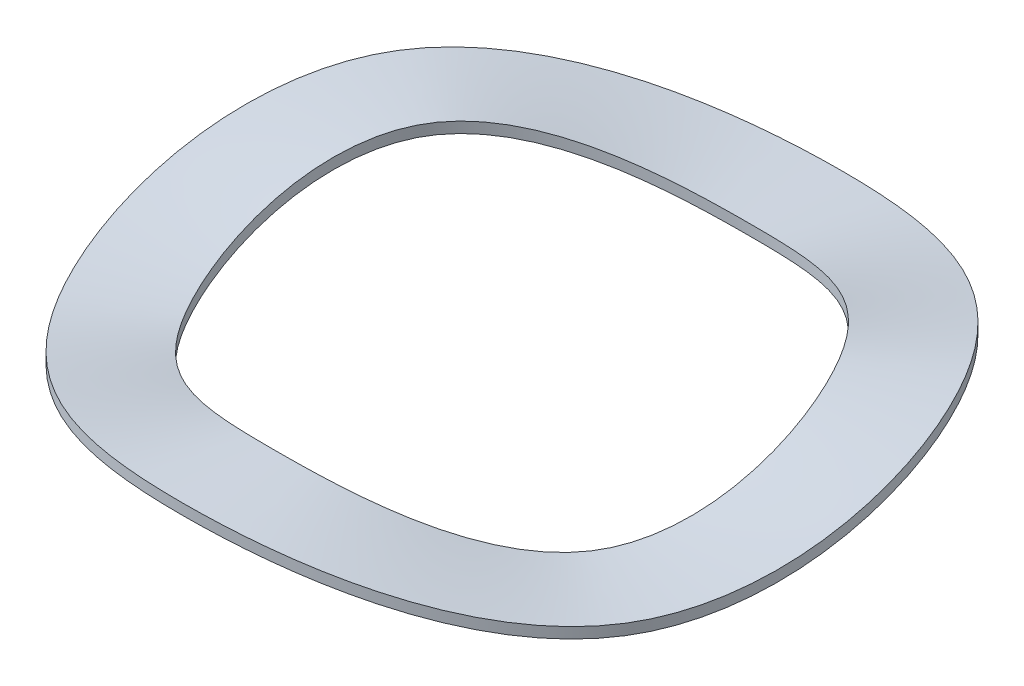
ISO-10303-21;
HEADER;
FILE_DESCRIPTION(('STEP AP214'),'2;1');
FILE_NAME('part.step','',(''),(''),'','','');
FILE_SCHEMA(('AUTOMOTIVE_DESIGN { 1 0 10303 214 1 1 1 1 }'));
ENDSEC;
DATA;
#1=APPLICATION_CONTEXT('core data for automotive mechanical design processes');
#2=APPLICATION_PROTOCOL_DEFINITION('international standard','automotive_design',2000,#1);
#3=PRODUCT_CONTEXT('',#1,'mechanical');
#4=PRODUCT('Part','Part','',(#3));
#5=PRODUCT_RELATED_PRODUCT_CATEGORY('part','',(#4));
#6=PRODUCT_DEFINITION_FORMATION('','',#4);
#7=PRODUCT_DEFINITION_CONTEXT('part definition',#1,'design');
#8=PRODUCT_DEFINITION('design','',#6,#7);
#9=PRODUCT_DEFINITION_SHAPE('','',#8);
#10=(LENGTH_UNIT() NAMED_UNIT(*) SI_UNIT(.MILLI.,.METRE.));
#11=(NAMED_UNIT(*) PLANE_ANGLE_UNIT() SI_UNIT($,.RADIAN.));
#12=(NAMED_UNIT(*) SI_UNIT($,.STERADIAN.) SOLID_ANGLE_UNIT());
#13=UNCERTAINTY_MEASURE_WITH_UNIT(LENGTH_MEASURE(1.E-05),#10,'distance_accuracy_value','');
#14=(GEOMETRIC_REPRESENTATION_CONTEXT(3) GLOBAL_UNCERTAINTY_ASSIGNED_CONTEXT((#13)) GLOBAL_UNIT_ASSIGNED_CONTEXT((#10,
#11,#12)) REPRESENTATION_CONTEXT('',''));
#15=CARTESIAN_POINT('',(0.,0.,0.));
#16=DIRECTION('',(0.,0.,1.));
#17=DIRECTION('',(1.,0.,0.));
#18=AXIS2_PLACEMENT_3D('',#15,#16,#17);
#19=CARTESIAN_POINT('',(0.,0.,-4.6609));
#20=CARTESIAN_POINT('',(1.61458312179956,0.,-4.66090000000001));
#21=CARTESIAN_POINT('',(4.84374936539867,1.2192,-2.79654000000002));
#22=CARTESIAN_POINT('',(4.84374936539864,-0.609599999999999,2.79654000000003));
#23=CARTESIAN_POINT('',(0.,1.2192,5.59308));
#24=CARTESIAN_POINT('',(-4.8437493653987,-0.6096,2.79653999999997));
#25=CARTESIAN_POINT('',(-4.84374936539867,0.609600000000001,-0.93218000000002));
#26=CARTESIAN_POINT('',(-3.2291662435991,0.609599999999999,-3.72872000000001));
#27=CARTESIAN_POINT('',(-1.61458312179955,0.,-4.6609));
#28=CARTESIAN_POINT('',(0.,0.,-4.6609));
#29=CARTESIAN_POINT('',(0.,0.0508,-4.6609));
#30=CARTESIAN_POINT('',(1.61458312179956,0.050799999999999,-4.66090000000001));
#31=CARTESIAN_POINT('',(4.84374936539867,1.27,-2.79654000000002));
#32=CARTESIAN_POINT('',(4.84374936539864,-0.558799999999999,2.79654000000003));
#33=CARTESIAN_POINT('',(0.,1.27,5.59308));
#34=CARTESIAN_POINT('',(-4.84374936539871,-0.558800000000001,2.79653999999997));
#35=CARTESIAN_POINT('',(-4.84374936539867,0.660400000000002,-0.932180000000018));
#36=CARTESIAN_POINT('',(-3.2291662435991,0.660399999999999,-3.72872000000001));
#37=CARTESIAN_POINT('',(-1.61458312179955,0.050800000000001,-4.6609));
#38=CARTESIAN_POINT('',(0.,0.0508,-4.6609));
#39=CARTESIAN_POINT('',(0.,0.1016,-4.66090000000001));
#40=CARTESIAN_POINT('',(1.61458312179956,0.101599999999999,-4.66090000000001));
#41=CARTESIAN_POINT('',(4.84374936539867,1.3208,-2.79654000000001));
#42=CARTESIAN_POINT('',(4.84374936539864,-0.507999999999999,2.79654000000003));
#43=CARTESIAN_POINT('',(0.,1.3208,5.59307999999999));
#44=CARTESIAN_POINT('',(-4.84374936539871,-0.508000000000001,2.79653999999997));
#45=CARTESIAN_POINT('',(-4.84374936539867,0.711200000000002,-0.932180000000016));
#46=CARTESIAN_POINT('',(-3.22916624359909,0.711199999999999,-3.72872000000001));
#47=CARTESIAN_POINT('',(-1.61458312179955,0.101600000000001,-4.6609));
#48=CARTESIAN_POINT('',(0.,0.1016,-4.66090000000001));
#49=CARTESIAN_POINT('',(0.,0.1524,-4.66090000000001));
#50=CARTESIAN_POINT('',(1.61458312179956,0.152399999999999,-4.66090000000001));
#51=CARTESIAN_POINT('',(4.84374936539866,1.3716,-2.79654000000001));
#52=CARTESIAN_POINT('',(4.84374936539864,-0.457199999999999,2.79654000000003));
#53=CARTESIAN_POINT('',(0.,1.3716,5.59307999999999));
#54=CARTESIAN_POINT('',(-4.84374936539871,-0.457200000000001,2.79653999999997));
#55=CARTESIAN_POINT('',(-4.84374936539867,0.762000000000002,-0.932180000000013));
#56=CARTESIAN_POINT('',(-3.22916624359909,0.762,-3.72872000000001));
#57=CARTESIAN_POINT('',(-1.61458312179955,0.152400000000001,-4.66090000000001));
#58=CARTESIAN_POINT('',(0.,0.1524,-4.66090000000001));
#59=B_SPLINE_SURFACE_WITH_KNOTS('',3,3,((#19,#20,#21,#22,#23,#24,#25,#26,#27,#28),(#29,#30,#31,
#32,#33,#34,#35,#36,#37,#38),(#39,#40,#41,#42,#43,#44,#45,#46,#47,#48),(#49,#50,#51,#52,#53,#54,
#55,#56,#57,#58)),.UNSPECIFIED.,.F.,.T.,.F.,(4,4),(4,1,1,1,1,2,4),(0.,1.),(0.,0.166666666666668,
0.333333333333334,0.5,0.666666666666666,0.833333333333333,1.),.UNSPECIFIED.);
#60=CARTESIAN_POINT('',(0.,0.,-4.6609));
#61=CARTESIAN_POINT('',(1.61458312179956,0.,-4.66090000000001));
#62=CARTESIAN_POINT('',(4.84374936539867,1.2192,-2.79654000000002));
#63=CARTESIAN_POINT('',(4.84374936539864,-0.609599999999999,2.79654000000003));
#64=CARTESIAN_POINT('',(0.,1.2192,5.59308));
#65=CARTESIAN_POINT('',(-4.8437493653987,-0.6096,2.79653999999997));
#66=CARTESIAN_POINT('',(-4.84374936539867,0.609600000000001,-0.93218000000002));
#67=CARTESIAN_POINT('',(-3.2291662435991,0.609599999999999,-3.72872000000001));
#68=CARTESIAN_POINT('',(-1.61458312179955,0.,-4.6609));
#69=CARTESIAN_POINT('',(0.,0.,-4.6609));
#70=B_SPLINE_CURVE_WITH_KNOTS('',3,(#60,#61,#62,#63,#64,#65,#66,#67,#68,#69),.UNSPECIFIED.,.T.,
.F.,(4,1,1,1,1,2,4),(0.,0.166666666666668,0.333333333333334,0.5,0.666666666666666,
0.833333333333333,1.),.UNSPECIFIED.);
#71=CARTESIAN_POINT('',(0.,0.,-4.6609));
#72=VERTEX_POINT('',#71);
#73=EDGE_CURVE('E11',#72,#72,#70,.F.);
#74=CARTESIAN_POINT('',(0.,0.1524,-4.66090000000001));
#75=CARTESIAN_POINT('',(1.61458312179956,0.152399999999999,-4.66090000000001));
#76=CARTESIAN_POINT('',(4.84374936539866,1.3716,-2.79654000000001));
#77=CARTESIAN_POINT('',(4.84374936539864,-0.457199999999999,2.79654000000003));
#78=CARTESIAN_POINT('',(0.,1.3716,5.59307999999999));
#79=CARTESIAN_POINT('',(-4.84374936539871,-0.457200000000001,2.79653999999997));
#80=CARTESIAN_POINT('',(-4.84374936539867,0.762000000000002,-0.932180000000013));
#81=CARTESIAN_POINT('',(-3.22916624359909,0.762,-3.72872000000001));
#82=CARTESIAN_POINT('',(-1.61458312179955,0.152400000000001,-4.66090000000001));
#83=CARTESIAN_POINT('',(0.,0.1524,-4.66090000000001));
#84=B_SPLINE_CURVE_WITH_KNOTS('',3,(#74,#75,#76,#77,#78,#79,#80,#81,#82,#83),.UNSPECIFIED.,.T.,
.F.,(4,1,1,1,1,2,4),(0.,0.166666666666668,0.333333333333334,0.5,0.666666666666666,
0.833333333333333,1.),.UNSPECIFIED.);
#85=CARTESIAN_POINT('',(0.,0.1524,-4.66090000000001));
#86=VERTEX_POINT('',#85);
#87=EDGE_CURVE('E47',#86,#86,#84,.T.);
#88=ORIENTED_EDGE('',*,*,#73,.T.);
#89=EDGE_LOOP('',(#88));
#90=FACE_BOUND('',#89,.T.);
#91=ORIENTED_EDGE('',*,*,#87,.T.);
#92=EDGE_LOOP('',(#91));
#93=FACE_BOUND('',#92,.T.);
#94=ADVANCED_FACE('F42',(#90,#93),#59,.T.);
#95=CARTESIAN_POINT('',(0.,0.,-3.3655));
#96=CARTESIAN_POINT('',(1.16584339857462,0.,-3.3655));
#97=CARTESIAN_POINT('',(3.49753019572384,1.2192,-2.01930000000002));
#98=CARTESIAN_POINT('',(3.49753019572382,-0.609599999999999,2.01930000000003));
#99=CARTESIAN_POINT('',(0.,1.2192,4.0386));
#100=CARTESIAN_POINT('',(-3.49753019572386,-0.6096,2.01929999999998));
#101=CARTESIAN_POINT('',(-3.49753019572383,0.609600000000001,-0.673100000000015));
#102=CARTESIAN_POINT('',(-2.33168679714921,0.609599999999999,-2.69240000000001));
#103=CARTESIAN_POINT('',(-1.16584339857461,0.,-3.3655));
#104=CARTESIAN_POINT('',(0.,0.,-3.3655));
#105=CARTESIAN_POINT('',(0.,0.,-3.7973));
#106=CARTESIAN_POINT('',(1.31542330631626,0.,-3.7973));
#107=CARTESIAN_POINT('',(3.94626991894879,1.2192,-2.27838000000002));
#108=CARTESIAN_POINT('',(3.94626991894876,-0.609599999999999,2.27838000000003));
#109=CARTESIAN_POINT('',(0.,1.2192,4.55676));
#110=CARTESIAN_POINT('',(-3.9462699189488,-0.6096,2.27837999999997));
#111=CARTESIAN_POINT('',(-3.94626991894878,0.609600000000001,-0.759460000000017));
#112=CARTESIAN_POINT('',(-2.63084661263251,0.609599999999999,-3.03784000000001));
#113=CARTESIAN_POINT('',(-1.31542330631626,0.,-3.7973));
#114=CARTESIAN_POINT('',(0.,0.,-3.7973));
#115=CARTESIAN_POINT('',(0.,0.,-4.2291));
#116=CARTESIAN_POINT('',(1.46500321405791,0.,-4.2291));
#117=CARTESIAN_POINT('',(4.39500964217373,1.2192,-2.53746000000002));
#118=CARTESIAN_POINT('',(4.3950096421737,-0.609599999999999,2.53746000000003));
#119=CARTESIAN_POINT('',(0.,1.2192,5.07492));
#120=CARTESIAN_POINT('',(-4.39500964217375,-0.6096,2.53745999999997));
#121=CARTESIAN_POINT('',(-4.39500964217373,0.609600000000001,-0.845820000000018));
#122=CARTESIAN_POINT('',(-2.9300064281158,0.609599999999999,-3.38328000000001));
#123=CARTESIAN_POINT('',(-1.4650032140579,0.,-4.2291));
#124=CARTESIAN_POINT('',(0.,0.,-4.2291));
#125=CARTESIAN_POINT('',(0.,0.,-4.6609));
#126=CARTESIAN_POINT('',(1.61458312179956,0.,-4.66090000000001));
#127=CARTESIAN_POINT('',(4.84374936539867,1.2192,-2.79654000000002));
#128=CARTESIAN_POINT('',(4.84374936539864,-0.609599999999999,2.79654000000003));
#129=CARTESIAN_POINT('',(0.,1.2192,5.59308));
#130=CARTESIAN_POINT('',(-4.8437493653987,-0.6096,2.79653999999997));
#131=CARTESIAN_POINT('',(-4.84374936539867,0.609600000000001,-0.93218000000002));
#132=CARTESIAN_POINT('',(-3.2291662435991,0.609599999999999,-3.72872000000001));
#133=CARTESIAN_POINT('',(-1.61458312179955,0.,-4.6609));
#134=CARTESIAN_POINT('',(0.,0.,-4.6609));
#135=B_SPLINE_SURFACE_WITH_KNOTS('',3,3,((#95,#96,#97,#98,#99,#100,#101,#102,#103,#104),(#105,
#106,#107,#108,#109,#110,#111,#112,#113,#114),(#115,#116,#117,#118,#119,#120,#121,#122,#123,
#124),(#125,#126,#127,#128,#129,#130,#131,#132,#133,#134)),.UNSPECIFIED.,.F.,.T.,.F.,(4,4),(4,1,
1,1,1,2,4),(0.,1.),(0.,0.166666666666668,0.333333333333334,0.5,0.666666666666666,
0.833333333333333,1.),.UNSPECIFIED.);
#136=CARTESIAN_POINT('',(0.,0.,-3.3655));
#137=CARTESIAN_POINT('',(1.16584339857462,0.,-3.3655));
#138=CARTESIAN_POINT('',(3.49753019572384,1.2192,-2.01930000000002));
#139=CARTESIAN_POINT('',(3.49753019572382,-0.609599999999999,2.01930000000003));
#140=CARTESIAN_POINT('',(0.,1.2192,4.0386));
#141=CARTESIAN_POINT('',(-3.49753019572386,-0.6096,2.01929999999998));
#142=CARTESIAN_POINT('',(-3.49753019572383,0.609600000000001,-0.673100000000015));
#143=CARTESIAN_POINT('',(-2.33168679714921,0.609599999999999,-2.69240000000001));
#144=CARTESIAN_POINT('',(-1.16584339857461,0.,-3.3655));
#145=CARTESIAN_POINT('',(0.,0.,-3.3655));
#146=B_SPLINE_CURVE_WITH_KNOTS('',3,(#136,#137,#138,#139,#140,#141,#142,#143,#144,#145),
.UNSPECIFIED.,.T.,.F.,(4,1,1,1,1,2,4),(0.,0.166666666666668,0.333333333333334,0.5,
0.666666666666666,0.833333333333333,1.),.UNSPECIFIED.);
#147=CARTESIAN_POINT('',(0.,0.,-3.3655));
#148=VERTEX_POINT('',#147);
#149=EDGE_CURVE('E67',#148,#148,#146,.T.);
#150=ORIENTED_EDGE('',*,*,#149,.F.);
#151=EDGE_LOOP('',(#150));
#152=FACE_BOUND('',#151,.T.);
#153=ORIENTED_EDGE('',*,*,#73,.F.);
#154=EDGE_LOOP('',(#153));
#155=FACE_BOUND('',#154,.T.);
#156=ADVANCED_FACE('F81',(#152,#155),#135,.T.);
#157=CARTESIAN_POINT('',(0.,0.1524,-4.66090000000001));
#158=CARTESIAN_POINT('',(1.61458312179956,0.152399999999999,-4.66090000000001));
#159=CARTESIAN_POINT('',(4.84374936539866,1.3716,-2.79654000000001));
#160=CARTESIAN_POINT('',(4.84374936539864,-0.457199999999999,2.79654000000003));
#161=CARTESIAN_POINT('',(0.,1.3716,5.59307999999999));
#162=CARTESIAN_POINT('',(-4.84374936539871,-0.457200000000001,2.79653999999997));
#163=CARTESIAN_POINT('',(-4.84374936539867,0.762000000000002,-0.932180000000013));
#164=CARTESIAN_POINT('',(-3.22916624359909,0.761999999999999,-3.72872000000001));
#165=CARTESIAN_POINT('',(-1.61458312179955,0.152400000000001,-4.66090000000001));
#166=CARTESIAN_POINT('',(0.,0.1524,-4.66090000000001));
#167=CARTESIAN_POINT('',(0.,0.1524,-4.22910000000001));
#168=CARTESIAN_POINT('',(1.46500321405791,0.152399999999999,-4.22910000000001));
#169=CARTESIAN_POINT('',(4.39500964217372,1.3716,-2.53746000000001));
#170=CARTESIAN_POINT('',(4.3950096421737,-0.4572,2.53746000000003));
#171=CARTESIAN_POINT('',(0.,1.3716,5.07491999999999));
#172=CARTESIAN_POINT('',(-4.39500964217376,-0.457200000000007,2.53745999999997));
#173=CARTESIAN_POINT('',(-4.39500964217372,0.762000000000001,-0.845820000000014));
#174=CARTESIAN_POINT('',(-2.9300064281158,0.762,-3.38328000000001));
#175=CARTESIAN_POINT('',(-1.4650032140579,0.152400000000001,-4.2291));
#176=CARTESIAN_POINT('',(0.,0.1524,-4.22910000000001));
#177=CARTESIAN_POINT('',(0.,0.1524,-3.7973));
#178=CARTESIAN_POINT('',(1.31542330631626,0.152399999999998,-3.79730000000001));
#179=CARTESIAN_POINT('',(3.94626991894878,1.3716,-2.27838000000002));
#180=CARTESIAN_POINT('',(3.94626991894876,-0.4572,2.27838000000003));
#181=CARTESIAN_POINT('',(0.,1.3716,4.55676));
#182=CARTESIAN_POINT('',(-3.94626991894881,-0.457200000000012,2.27837999999998));
#183=CARTESIAN_POINT('',(-3.94626991894878,0.762,-0.759460000000014));
#184=CARTESIAN_POINT('',(-2.6308466126325,0.762000000000001,-3.03784000000001));
#185=CARTESIAN_POINT('',(-1.31542330631625,0.152400000000001,-3.7973));
#186=CARTESIAN_POINT('',(0.,0.1524,-3.7973));
#187=CARTESIAN_POINT('',(0.,0.1524,-3.3655));
#188=CARTESIAN_POINT('',(1.16584339857462,0.152399999999998,-3.3655));
#189=CARTESIAN_POINT('',(3.49753019572384,1.3716,-2.01930000000002));
#190=CARTESIAN_POINT('',(3.49753019572382,-0.457200000000001,2.01930000000003));
#191=CARTESIAN_POINT('',(0.,1.3716,4.0386));
#192=CARTESIAN_POINT('',(-3.49753019572386,-0.457200000000018,2.01929999999998));
#193=CARTESIAN_POINT('',(-3.49753019572383,0.761999999999999,-0.673100000000015));
#194=CARTESIAN_POINT('',(-2.33168679714921,0.762000000000002,-2.69240000000001));
#195=CARTESIAN_POINT('',(-1.16584339857461,0.152400000000001,-3.3655));
#196=CARTESIAN_POINT('',(0.,0.1524,-3.3655));
#197=B_SPLINE_SURFACE_WITH_KNOTS('',3,3,((#157,#158,#159,#160,#161,#162,#163,#164,#165,#166),
(#167,#168,#169,#170,#171,#172,#173,#174,#175,#176),(#177,#178,#179,#180,#181,#182,#183,#184,
#185,#186),(#187,#188,#189,#190,#191,#192,#193,#194,#195,#196)),.UNSPECIFIED.,.F.,.T.,.F.,(4,4),
(4,1,1,1,1,2,4),(0.,1.),(0.,0.166666666666668,0.333333333333334,0.5,0.666666666666666,
0.833333333333333,1.),.UNSPECIFIED.);
#198=CARTESIAN_POINT('',(0.,0.1524,-3.3655));
#199=CARTESIAN_POINT('',(1.16584339857462,0.152399999999998,-3.3655));
#200=CARTESIAN_POINT('',(3.49753019572384,1.3716,-2.01930000000002));
#201=CARTESIAN_POINT('',(3.49753019572382,-0.457200000000001,2.01930000000003));
#202=CARTESIAN_POINT('',(0.,1.3716,4.0386));
#203=CARTESIAN_POINT('',(-3.49753019572386,-0.457200000000018,2.01929999999998));
#204=CARTESIAN_POINT('',(-3.49753019572383,0.761999999999999,-0.673100000000015));
#205=CARTESIAN_POINT('',(-2.33168679714921,0.762000000000002,-2.69240000000001));
#206=CARTESIAN_POINT('',(-1.16584339857461,0.152400000000001,-3.3655));
#207=CARTESIAN_POINT('',(0.,0.1524,-3.3655));
#208=B_SPLINE_CURVE_WITH_KNOTS('',3,(#198,#199,#200,#201,#202,#203,#204,#205,#206,#207),
.UNSPECIFIED.,.T.,.F.,(4,1,1,1,1,2,4),(0.,0.166666666666668,0.333333333333334,0.5,
0.666666666666666,0.833333333333333,1.),.UNSPECIFIED.);
#209=CARTESIAN_POINT('',(0.,0.1524,-3.3655));
#210=VERTEX_POINT('',#209);
#211=EDGE_CURVE('E56',#210,#210,#208,.T.);
#212=ORIENTED_EDGE('',*,*,#87,.F.);
#213=EDGE_LOOP('',(#212));
#214=FACE_BOUND('',#213,.T.);
#215=ORIENTED_EDGE('',*,*,#211,.T.);
#216=EDGE_LOOP('',(#215));
#217=FACE_BOUND('',#216,.T.);
#218=ADVANCED_FACE('F84',(#214,#217),#197,.T.);
#219=CARTESIAN_POINT('',(0.,0.1524,-3.3655));
#220=CARTESIAN_POINT('',(1.16584339857462,0.152399999999998,-3.3655));
#221=CARTESIAN_POINT('',(3.49753019572384,1.3716,-2.01930000000002));
#222=CARTESIAN_POINT('',(3.49753019572382,-0.457200000000001,2.01930000000003));
#223=CARTESIAN_POINT('',(0.,1.3716,4.0386));
#224=CARTESIAN_POINT('',(-3.49753019572386,-0.457200000000018,2.01929999999998));
#225=CARTESIAN_POINT('',(-3.49753019572383,0.761999999999999,-0.673100000000015));
#226=CARTESIAN_POINT('',(-2.33168679714921,0.762000000000002,-2.69240000000001));
#227=CARTESIAN_POINT('',(-1.16584339857461,0.152400000000001,-3.3655));
#228=CARTESIAN_POINT('',(0.,0.1524,-3.3655));
#229=CARTESIAN_POINT('',(0.,0.1016,-3.3655));
#230=CARTESIAN_POINT('',(1.16584339857462,0.101599999999998,-3.3655));
#231=CARTESIAN_POINT('',(3.49753019572384,1.3208,-2.01930000000002));
#232=CARTESIAN_POINT('',(3.49753019572382,-0.508,2.01930000000003));
#233=CARTESIAN_POINT('',(0.,1.3208,4.0386));
#234=CARTESIAN_POINT('',(-3.49753019572386,-0.508000000000012,2.01929999999998));
#235=CARTESIAN_POINT('',(-3.49753019572383,0.7112,-0.673100000000015));
#236=CARTESIAN_POINT('',(-2.33168679714921,0.711200000000001,-2.69240000000001));
#237=CARTESIAN_POINT('',(-1.16584339857461,0.101600000000001,-3.3655));
#238=CARTESIAN_POINT('',(0.,0.1016,-3.3655));
#239=CARTESIAN_POINT('',(0.,0.0507999999999999,-3.3655));
#240=CARTESIAN_POINT('',(1.16584339857462,0.0507999999999987,-3.3655));
#241=CARTESIAN_POINT('',(3.49753019572384,1.27,-2.01930000000002));
#242=CARTESIAN_POINT('',(3.49753019572382,-0.558799999999999,2.01930000000003));
#243=CARTESIAN_POINT('',(0.,1.27,4.0386));
#244=CARTESIAN_POINT('',(-3.49753019572386,-0.558800000000006,2.01929999999998));
#245=CARTESIAN_POINT('',(-3.49753019572383,0.660400000000001,-0.673100000000015));
#246=CARTESIAN_POINT('',(-2.33168679714921,0.6604,-2.69240000000001));
#247=CARTESIAN_POINT('',(-1.16584339857461,0.0508000000000011,-3.3655));
#248=CARTESIAN_POINT('',(0.,0.0507999999999999,-3.3655));
#249=CARTESIAN_POINT('',(0.,0.,-3.3655));
#250=CARTESIAN_POINT('',(1.16584339857462,0.,-3.3655));
#251=CARTESIAN_POINT('',(3.49753019572384,1.2192,-2.01930000000002));
#252=CARTESIAN_POINT('',(3.49753019572382,-0.609599999999999,2.01930000000003));
#253=CARTESIAN_POINT('',(0.,1.2192,4.0386));
#254=CARTESIAN_POINT('',(-3.49753019572386,-0.6096,2.01929999999998));
#255=CARTESIAN_POINT('',(-3.49753019572383,0.609600000000001,-0.673100000000015));
#256=CARTESIAN_POINT('',(-2.33168679714921,0.609599999999999,-2.69240000000001));
#257=CARTESIAN_POINT('',(-1.16584339857461,0.,-3.3655));
#258=CARTESIAN_POINT('',(0.,0.,-3.3655));
#259=B_SPLINE_SURFACE_WITH_KNOTS('',3,3,((#219,#220,#221,#222,#223,#224,#225,#226,#227,#228),
(#229,#230,#231,#232,#233,#234,#235,#236,#237,#238),(#239,#240,#241,#242,#243,#244,#245,#246,
#247,#248),(#249,#250,#251,#252,#253,#254,#255,#256,#257,#258)),.UNSPECIFIED.,.F.,.T.,.F.,(4,4),
(4,1,1,1,1,2,4),(0.,1.),(0.,0.166666666666668,0.333333333333334,0.5,0.666666666666666,
0.833333333333333,1.),.UNSPECIFIED.);
#260=ORIENTED_EDGE('',*,*,#211,.F.);
#261=EDGE_LOOP('',(#260));
#262=FACE_BOUND('',#261,.T.);
#263=ORIENTED_EDGE('',*,*,#149,.T.);
#264=EDGE_LOOP('',(#263));
#265=FACE_BOUND('',#264,.T.);
#266=ADVANCED_FACE('F79',(#262,#265),#259,.T.);
#267=CLOSED_SHELL('',(#94,#156,#218,#266));
#268=MANIFOLD_SOLID_BREP('B2',#267);
#269=ADVANCED_BREP_SHAPE_REPRESENTATION('',(#18,#268),#14);
#270=SHAPE_DEFINITION_REPRESENTATION(#9,#269);
ENDSEC;
END-ISO-10303-21;
